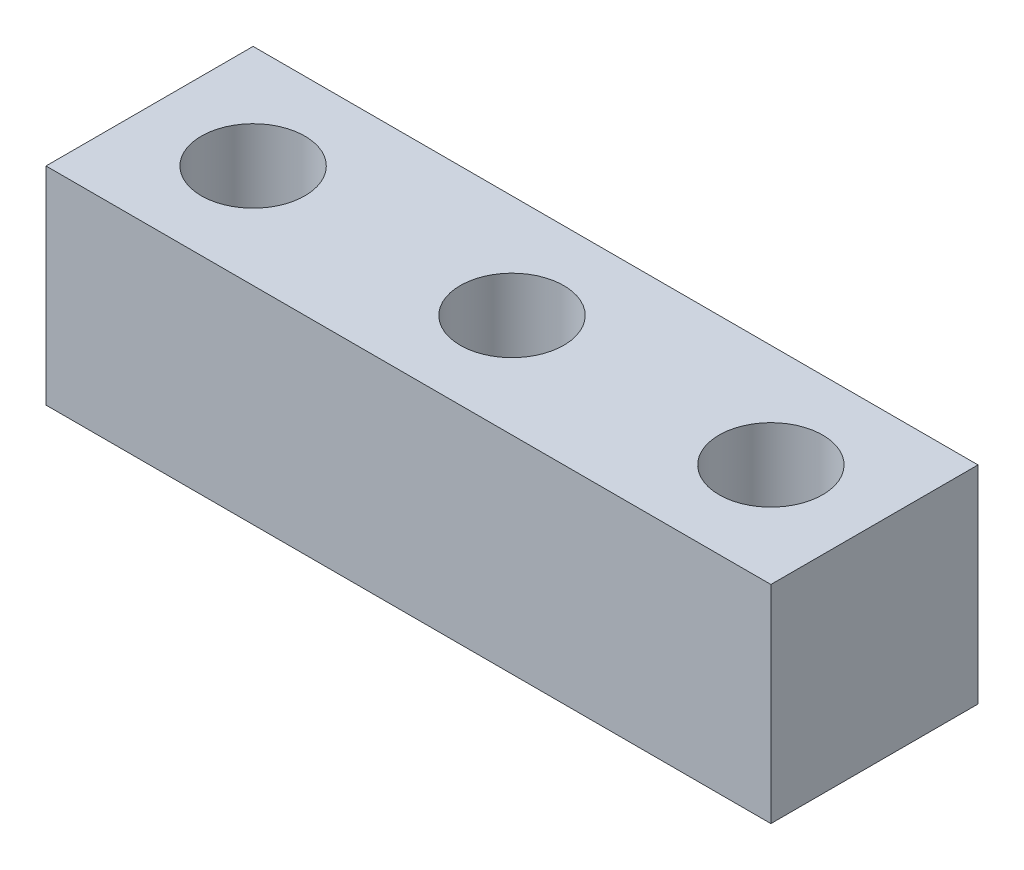
ISO-10303-21;
HEADER;
FILE_DESCRIPTION(('STEP AP214'),'2;1');
FILE_NAME('part.step','',(''),(''),'','','');
FILE_SCHEMA(('AUTOMOTIVE_DESIGN { 1 0 10303 214 1 1 1 1 }'));
ENDSEC;
DATA;
#1=APPLICATION_CONTEXT('core data for automotive mechanical design processes');
#2=APPLICATION_PROTOCOL_DEFINITION('international standard','automotive_design',2000,#1);
#3=PRODUCT_CONTEXT('',#1,'mechanical');
#4=PRODUCT('Part','Part','',(#3));
#5=PRODUCT_RELATED_PRODUCT_CATEGORY('part','',(#4));
#6=PRODUCT_DEFINITION_FORMATION('','',#4);
#7=PRODUCT_DEFINITION_CONTEXT('part definition',#1,'design');
#8=PRODUCT_DEFINITION('design','',#6,#7);
#9=PRODUCT_DEFINITION_SHAPE('','',#8);
#10=(LENGTH_UNIT() NAMED_UNIT(*) SI_UNIT(.MILLI.,.METRE.));
#11=(NAMED_UNIT(*) PLANE_ANGLE_UNIT() SI_UNIT($,.RADIAN.));
#12=(NAMED_UNIT(*) SI_UNIT($,.STERADIAN.) SOLID_ANGLE_UNIT());
#13=UNCERTAINTY_MEASURE_WITH_UNIT(LENGTH_MEASURE(1.E-05),#10,'distance_accuracy_value','');
#14=(GEOMETRIC_REPRESENTATION_CONTEXT(3) GLOBAL_UNCERTAINTY_ASSIGNED_CONTEXT((#13)) GLOBAL_UNIT_ASSIGNED_CONTEXT((#10,
#11,#12)) REPRESENTATION_CONTEXT('',''));
#15=CARTESIAN_POINT('',(0.,0.,0.));
#16=DIRECTION('',(0.,0.,1.));
#17=DIRECTION('',(1.,0.,0.));
#18=AXIS2_PLACEMENT_3D('',#15,#16,#17);
#19=CARTESIAN_POINT('',(0.,12.7,0.));
#20=DIRECTION('',(0.,-1.,0.));
#21=DIRECTION('',(0.,0.,-1.));
#22=AXIS2_PLACEMENT_3D('',#19,#20,#21);
#23=PLANE('',#22);
#24=DIRECTION('',(0.,0.,1.));
#25=VECTOR('',#24,1.);
#26=CARTESIAN_POINT('',(-22.225,12.7,-6.35));
#27=LINE('',#26,#25);
#28=CARTESIAN_POINT('',(-22.225,12.7,-6.35));
#29=VERTEX_POINT('',#28);
#30=CARTESIAN_POINT('',(-22.225,12.7,6.35));
#31=VERTEX_POINT('',#30);
#32=EDGE_CURVE('E86',#29,#31,#27,.T.);
#33=ORIENTED_EDGE('',*,*,#32,.T.);
#34=DIRECTION('',(1.,0.,0.));
#35=VECTOR('',#34,1.);
#36=CARTESIAN_POINT('',(22.225,12.7,6.35));
#37=LINE('',#36,#35);
#38=CARTESIAN_POINT('',(22.225,12.7,6.35));
#39=VERTEX_POINT('',#38);
#40=EDGE_CURVE('E81',#31,#39,#37,.T.);
#41=ORIENTED_EDGE('',*,*,#40,.T.);
#42=DIRECTION('',(0.,0.,-1.));
#43=VECTOR('',#42,1.);
#44=CARTESIAN_POINT('',(22.225,12.7,-6.35));
#45=LINE('',#44,#43);
#46=CARTESIAN_POINT('',(22.225,12.7,-6.35));
#47=VERTEX_POINT('',#46);
#48=EDGE_CURVE('E84',#39,#47,#45,.T.);
#49=ORIENTED_EDGE('',*,*,#48,.T.);
#50=DIRECTION('',(-1.,0.,0.));
#51=VECTOR('',#50,1.);
#52=CARTESIAN_POINT('',(22.225,12.7,-6.35));
#53=LINE('',#52,#51);
#54=EDGE_CURVE('E51',#47,#29,#53,.T.);
#55=ORIENTED_EDGE('',*,*,#54,.T.);
#56=EDGE_LOOP('',(#33,#41,#49,#55));
#57=FACE_BOUND('',#56,.T.);
#58=CARTESIAN_POINT('',(-15.875,12.7,0.));
#59=DIRECTION('',(0.,1.,0.));
#60=DIRECTION('',(0.,0.,1.));
#61=AXIS2_PLACEMENT_3D('',#58,#59,#60);
#62=CIRCLE('',#61,3.175);
#63=CARTESIAN_POINT('',(-15.875,12.7,3.175));
#64=VERTEX_POINT('',#63);
#65=EDGE_CURVE('E101',#64,#64,#62,.T.);
#66=ORIENTED_EDGE('',*,*,#65,.F.);
#67=EDGE_LOOP('',(#66));
#68=FACE_BOUND('',#67,.T.);
#69=CARTESIAN_POINT('',(15.875,12.7,0.));
#70=DIRECTION('',(0.,1.,0.));
#71=DIRECTION('',(0.,0.,1.));
#72=AXIS2_PLACEMENT_3D('',#69,#70,#71);
#73=CIRCLE('',#72,3.175);
#74=CARTESIAN_POINT('',(15.875,12.7,3.175));
#75=VERTEX_POINT('',#74);
#76=EDGE_CURVE('E116',#75,#75,#73,.T.);
#77=ORIENTED_EDGE('',*,*,#76,.F.);
#78=EDGE_LOOP('',(#77));
#79=FACE_BOUND('',#78,.T.);
#80=CARTESIAN_POINT('',(0.,12.7,0.));
#81=DIRECTION('',(0.,1.,0.));
#82=DIRECTION('',(0.,0.,1.));
#83=AXIS2_PLACEMENT_3D('',#80,#81,#82);
#84=CIRCLE('',#83,3.175);
#85=CARTESIAN_POINT('',(0.,12.7,3.175));
#86=VERTEX_POINT('',#85);
#87=EDGE_CURVE('E122',#86,#86,#84,.T.);
#88=ORIENTED_EDGE('',*,*,#87,.F.);
#89=EDGE_LOOP('',(#88));
#90=FACE_BOUND('',#89,.T.);
#91=ADVANCED_FACE('F34',(#57,#68,#79,#90),#23,.F.);
#92=CARTESIAN_POINT('',(0.,0.,0.));
#93=DIRECTION('',(0.,-1.,0.));
#94=DIRECTION('',(0.,0.,-1.));
#95=AXIS2_PLACEMENT_3D('',#92,#93,#94);
#96=PLANE('',#95);
#97=CARTESIAN_POINT('',(15.875,0.,0.));
#98=DIRECTION('',(0.,1.,0.));
#99=DIRECTION('',(0.,0.,1.));
#100=AXIS2_PLACEMENT_3D('',#97,#98,#99);
#101=CIRCLE('',#100,3.175);
#102=CARTESIAN_POINT('',(15.875,0.,3.175));
#103=VERTEX_POINT('',#102);
#104=EDGE_CURVE('E119',#103,#103,#101,.T.);
#105=ORIENTED_EDGE('',*,*,#104,.T.);
#106=EDGE_LOOP('',(#105));
#107=FACE_BOUND('',#106,.T.);
#108=DIRECTION('',(0.,0.,1.));
#109=VECTOR('',#108,1.);
#110=CARTESIAN_POINT('',(-22.225,0.,-6.35));
#111=LINE('',#110,#109);
#112=CARTESIAN_POINT('',(-22.225,0.,-6.35));
#113=VERTEX_POINT('',#112);
#114=CARTESIAN_POINT('',(-22.225,0.,6.35));
#115=VERTEX_POINT('',#114);
#116=EDGE_CURVE('E98',#113,#115,#111,.T.);
#117=ORIENTED_EDGE('',*,*,#116,.F.);
#118=DIRECTION('',(-1.,0.,0.));
#119=VECTOR('',#118,1.);
#120=CARTESIAN_POINT('',(22.225,0.,-6.35));
#121=LINE('',#120,#119);
#122=CARTESIAN_POINT('',(22.225,0.,-6.35));
#123=VERTEX_POINT('',#122);
#124=EDGE_CURVE('E74',#123,#113,#121,.T.);
#125=ORIENTED_EDGE('',*,*,#124,.F.);
#126=DIRECTION('',(0.,0.,-1.));
#127=VECTOR('',#126,1.);
#128=CARTESIAN_POINT('',(22.225,0.,-6.35));
#129=LINE('',#128,#127);
#130=CARTESIAN_POINT('',(22.225,0.,6.35));
#131=VERTEX_POINT('',#130);
#132=EDGE_CURVE('E68',#131,#123,#129,.T.);
#133=ORIENTED_EDGE('',*,*,#132,.F.);
#134=DIRECTION('',(1.,0.,0.));
#135=VECTOR('',#134,1.);
#136=CARTESIAN_POINT('',(22.225,0.,6.35));
#137=LINE('',#136,#135);
#138=EDGE_CURVE('E90',#115,#131,#137,.T.);
#139=ORIENTED_EDGE('',*,*,#138,.F.);
#140=EDGE_LOOP('',(#117,#125,#133,#139));
#141=FACE_BOUND('',#140,.T.);
#142=CARTESIAN_POINT('',(-15.875,0.,0.));
#143=DIRECTION('',(0.,1.,0.));
#144=DIRECTION('',(0.,0.,1.));
#145=AXIS2_PLACEMENT_3D('',#142,#143,#144);
#146=CIRCLE('',#145,3.175);
#147=CARTESIAN_POINT('',(-15.875,0.,3.175));
#148=VERTEX_POINT('',#147);
#149=EDGE_CURVE('E113',#148,#148,#146,.T.);
#150=ORIENTED_EDGE('',*,*,#149,.T.);
#151=EDGE_LOOP('',(#150));
#152=FACE_BOUND('',#151,.T.);
#153=CARTESIAN_POINT('',(0.,0.,0.));
#154=DIRECTION('',(0.,1.,0.));
#155=DIRECTION('',(0.,0.,1.));
#156=AXIS2_PLACEMENT_3D('',#153,#154,#155);
#157=CIRCLE('',#156,3.175);
#158=CARTESIAN_POINT('',(0.,0.,3.175));
#159=VERTEX_POINT('',#158);
#160=EDGE_CURVE('E125',#159,#159,#157,.T.);
#161=ORIENTED_EDGE('',*,*,#160,.T.);
#162=EDGE_LOOP('',(#161));
#163=FACE_BOUND('',#162,.T.);
#164=ADVANCED_FACE('F109',(#107,#141,#152,#163),#96,.T.);
#165=CARTESIAN_POINT('',(-22.225,12.7,-6.35));
#166=DIRECTION('',(1.,0.,0.));
#167=DIRECTION('',(0.,0.,-1.));
#168=AXIS2_PLACEMENT_3D('',#165,#166,#167);
#169=PLANE('',#168);
#170=ORIENTED_EDGE('',*,*,#116,.T.);
#171=DIRECTION('',(0.,-1.,0.));
#172=VECTOR('',#171,1.);
#173=CARTESIAN_POINT('',(-22.225,12.7,6.35));
#174=LINE('',#173,#172);
#175=EDGE_CURVE('E11',#31,#115,#174,.T.);
#176=ORIENTED_EDGE('',*,*,#175,.F.);
#177=ORIENTED_EDGE('',*,*,#32,.F.);
#178=DIRECTION('',(0.,-1.,0.));
#179=VECTOR('',#178,1.);
#180=CARTESIAN_POINT('',(-22.225,12.7,-6.35));
#181=LINE('',#180,#179);
#182=EDGE_CURVE('E94',#29,#113,#181,.T.);
#183=ORIENTED_EDGE('',*,*,#182,.T.);
#184=EDGE_LOOP('',(#170,#176,#177,#183));
#185=FACE_BOUND('',#184,.T.);
#186=ADVANCED_FACE('F36',(#185),#169,.F.);
#187=CARTESIAN_POINT('',(22.225,12.7,6.35));
#188=DIRECTION('',(0.,0.,-1.));
#189=DIRECTION('',(-1.,0.,0.));
#190=AXIS2_PLACEMENT_3D('',#187,#188,#189);
#191=PLANE('',#190);
#192=ORIENTED_EDGE('',*,*,#138,.T.);
#193=DIRECTION('',(0.,-1.,0.));
#194=VECTOR('',#193,1.);
#195=CARTESIAN_POINT('',(22.225,12.7,6.35));
#196=LINE('',#195,#194);
#197=EDGE_CURVE('E43',#39,#131,#196,.T.);
#198=ORIENTED_EDGE('',*,*,#197,.F.);
#199=ORIENTED_EDGE('',*,*,#40,.F.);
#200=ORIENTED_EDGE('',*,*,#175,.T.);
#201=EDGE_LOOP('',(#192,#198,#199,#200));
#202=FACE_BOUND('',#201,.T.);
#203=ADVANCED_FACE('F89',(#202),#191,.F.);
#204=CARTESIAN_POINT('',(22.225,12.7,-6.35));
#205=DIRECTION('',(-1.,0.,0.));
#206=DIRECTION('',(0.,0.,1.));
#207=AXIS2_PLACEMENT_3D('',#204,#205,#206);
#208=PLANE('',#207);
#209=ORIENTED_EDGE('',*,*,#132,.T.);
#210=DIRECTION('',(0.,-1.,0.));
#211=VECTOR('',#210,1.);
#212=CARTESIAN_POINT('',(22.225,12.7,-6.35));
#213=LINE('',#212,#211);
#214=EDGE_CURVE('E91',#47,#123,#213,.T.);
#215=ORIENTED_EDGE('',*,*,#214,.F.);
#216=ORIENTED_EDGE('',*,*,#48,.F.);
#217=ORIENTED_EDGE('',*,*,#197,.T.);
#218=EDGE_LOOP('',(#209,#215,#216,#217));
#219=FACE_BOUND('',#218,.T.);
#220=ADVANCED_FACE('F92',(#219),#208,.F.);
#221=CARTESIAN_POINT('',(22.225,12.7,-6.35));
#222=DIRECTION('',(0.,0.,1.));
#223=DIRECTION('',(1.,0.,0.));
#224=AXIS2_PLACEMENT_3D('',#221,#222,#223);
#225=PLANE('',#224);
#226=ORIENTED_EDGE('',*,*,#124,.T.);
#227=ORIENTED_EDGE('',*,*,#182,.F.);
#228=ORIENTED_EDGE('',*,*,#54,.F.);
#229=ORIENTED_EDGE('',*,*,#214,.T.);
#230=EDGE_LOOP('',(#226,#227,#228,#229));
#231=FACE_BOUND('',#230,.T.);
#232=ADVANCED_FACE('F106',(#231),#225,.F.);
#233=CARTESIAN_POINT('',(-15.875,12.7,0.));
#234=DIRECTION('',(0.,-1.,0.));
#235=DIRECTION('',(0.,0.,-1.));
#236=AXIS2_PLACEMENT_3D('',#233,#234,#235);
#237=CYLINDRICAL_SURFACE('',#236,3.175);
#238=ORIENTED_EDGE('',*,*,#65,.T.);
#239=EDGE_LOOP('',(#238));
#240=FACE_BOUND('',#239,.T.);
#241=ORIENTED_EDGE('',*,*,#149,.F.);
#242=EDGE_LOOP('',(#241));
#243=FACE_BOUND('',#242,.T.);
#244=ADVANCED_FACE('F142',(#240,#243),#237,.F.);
#245=CARTESIAN_POINT('',(15.875,12.7,0.));
#246=DIRECTION('',(0.,-1.,0.));
#247=DIRECTION('',(0.,0.,-1.));
#248=AXIS2_PLACEMENT_3D('',#245,#246,#247);
#249=CYLINDRICAL_SURFACE('',#248,3.175);
#250=ORIENTED_EDGE('',*,*,#76,.T.);
#251=EDGE_LOOP('',(#250));
#252=FACE_BOUND('',#251,.T.);
#253=ORIENTED_EDGE('',*,*,#104,.F.);
#254=EDGE_LOOP('',(#253));
#255=FACE_BOUND('',#254,.T.);
#256=ADVANCED_FACE('F188',(#252,#255),#249,.F.);
#257=CARTESIAN_POINT('',(0.,12.7,0.));
#258=DIRECTION('',(0.,-1.,0.));
#259=DIRECTION('',(0.,0.,-1.));
#260=AXIS2_PLACEMENT_3D('',#257,#258,#259);
#261=CYLINDRICAL_SURFACE('',#260,3.175);
#262=ORIENTED_EDGE('',*,*,#87,.T.);
#263=EDGE_LOOP('',(#262));
#264=FACE_BOUND('',#263,.T.);
#265=ORIENTED_EDGE('',*,*,#160,.F.);
#266=EDGE_LOOP('',(#265));
#267=FACE_BOUND('',#266,.T.);
#268=ADVANCED_FACE('F131',(#264,#267),#261,.F.);
#269=CLOSED_SHELL('',(#91,#164,#186,#203,#220,#232,#244,#256,#268));
#270=MANIFOLD_SOLID_BREP('B2',#269);
#271=ADVANCED_BREP_SHAPE_REPRESENTATION('',(#18,#270),#14);
#272=SHAPE_DEFINITION_REPRESENTATION(#9,#271);
ENDSEC;
END-ISO-10303-21;
